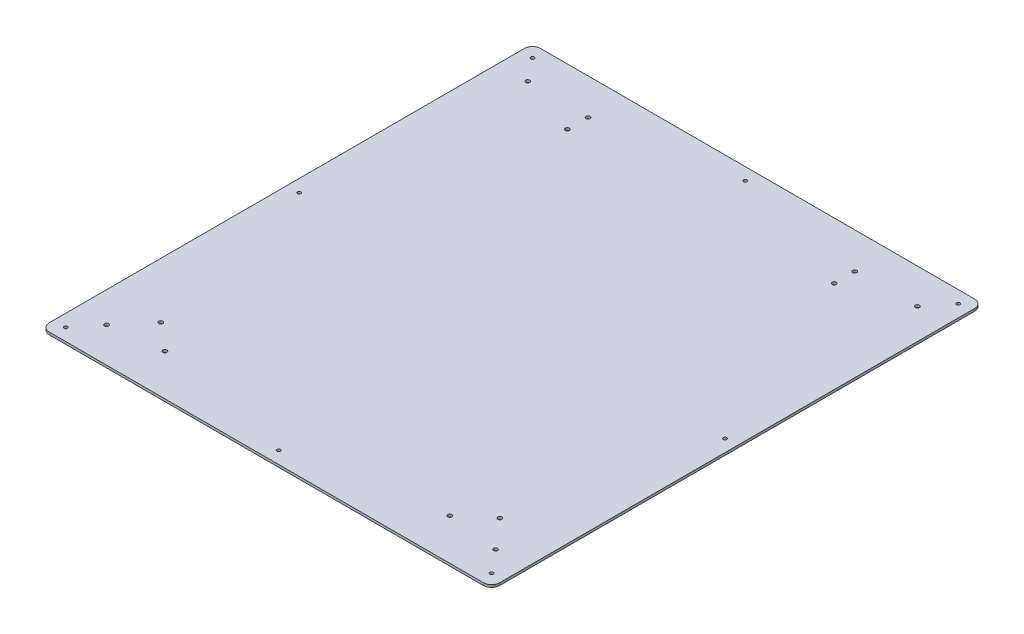
ISO-10303-21;
HEADER;
FILE_DESCRIPTION(('STEP AP214'),'2;1');
FILE_NAME('part.step','',(''),(''),'','','');
FILE_SCHEMA(('AUTOMOTIVE_DESIGN { 1 0 10303 214 1 1 1 1 }'));
ENDSEC;
DATA;
#1=APPLICATION_CONTEXT('core data for automotive mechanical design processes');
#2=APPLICATION_PROTOCOL_DEFINITION('international standard','automotive_design',2000,#1);
#3=PRODUCT_CONTEXT('',#1,'mechanical');
#4=PRODUCT('Part','Part','',(#3));
#5=PRODUCT_RELATED_PRODUCT_CATEGORY('part','',(#4));
#6=PRODUCT_DEFINITION_FORMATION('','',#4);
#7=PRODUCT_DEFINITION_CONTEXT('part definition',#1,'design');
#8=PRODUCT_DEFINITION('design','',#6,#7);
#9=PRODUCT_DEFINITION_SHAPE('','',#8);
#10=(LENGTH_UNIT() NAMED_UNIT(*) SI_UNIT(.MILLI.,.METRE.));
#11=(NAMED_UNIT(*) PLANE_ANGLE_UNIT() SI_UNIT($,.RADIAN.));
#12=(NAMED_UNIT(*) SI_UNIT($,.STERADIAN.) SOLID_ANGLE_UNIT());
#13=UNCERTAINTY_MEASURE_WITH_UNIT(LENGTH_MEASURE(1.E-05),#10,'distance_accuracy_value','');
#14=(GEOMETRIC_REPRESENTATION_CONTEXT(3) GLOBAL_UNCERTAINTY_ASSIGNED_CONTEXT((#13)) GLOBAL_UNIT_ASSIGNED_CONTEXT((#10,
#11,#12)) REPRESENTATION_CONTEXT('',''));
#15=CARTESIAN_POINT('',(0.,0.,0.));
#16=DIRECTION('',(0.,0.,1.));
#17=DIRECTION('',(1.,0.,0.));
#18=AXIS2_PLACEMENT_3D('',#15,#16,#17);
#19=CARTESIAN_POINT('',(265.,-3.,-290.));
#20=DIRECTION('',(0.,1.,0.));
#21=DIRECTION('',(0.,0.,1.));
#22=AXIS2_PLACEMENT_3D('',#19,#20,#21);
#23=CYLINDRICAL_SURFACE('',#22,10.);
#24=CARTESIAN_POINT('',(265.,0.,-290.));
#25=DIRECTION('',(0.,1.,0.));
#26=DIRECTION('',(0.,0.,-1.));
#27=AXIS2_PLACEMENT_3D('',#24,#25,#26);
#28=CIRCLE('',#27,10.);
#29=CARTESIAN_POINT('',(275.,0.,-290.));
#30=VERTEX_POINT('',#29);
#31=CARTESIAN_POINT('',(265.,0.,-300.));
#32=VERTEX_POINT('',#31);
#33=EDGE_CURVE('E142',#30,#32,#28,.T.);
#34=ORIENTED_EDGE('',*,*,#33,.F.);
#35=DIRECTION('',(0.,1.,0.));
#36=VECTOR('',#35,1.);
#37=CARTESIAN_POINT('',(275.,-3.,-290.));
#38=LINE('',#37,#36);
#39=CARTESIAN_POINT('',(275.,-3.,-290.));
#40=VERTEX_POINT('',#39);
#41=EDGE_CURVE('E11',#40,#30,#38,.T.);
#42=ORIENTED_EDGE('',*,*,#41,.F.);
#43=CARTESIAN_POINT('',(265.,-3.,-290.));
#44=DIRECTION('',(0.,1.,0.));
#45=DIRECTION('',(0.,0.,-1.));
#46=AXIS2_PLACEMENT_3D('',#43,#44,#45);
#47=CIRCLE('',#46,10.);
#48=CARTESIAN_POINT('',(265.,-3.,-300.));
#49=VERTEX_POINT('',#48);
#50=EDGE_CURVE('E163',#40,#49,#47,.T.);
#51=ORIENTED_EDGE('',*,*,#50,.T.);
#52=DIRECTION('',(0.,1.,0.));
#53=VECTOR('',#52,1.);
#54=CARTESIAN_POINT('',(265.,-3.,-300.));
#55=LINE('',#54,#53);
#56=EDGE_CURVE('E48',#49,#32,#55,.T.);
#57=ORIENTED_EDGE('',*,*,#56,.T.);
#58=EDGE_LOOP('',(#34,#42,#51,#57));
#59=FACE_BOUND('',#58,.T.);
#60=ADVANCED_FACE('F45',(#59),#23,.T.);
#61=CARTESIAN_POINT('',(275.,-3.,290.));
#62=DIRECTION('',(1.,0.,0.));
#63=DIRECTION('',(0.,0.,-1.));
#64=AXIS2_PLACEMENT_3D('',#61,#62,#63);
#65=PLANE('',#64);
#66=DIRECTION('',(0.,0.,-1.));
#67=VECTOR('',#66,1.);
#68=CARTESIAN_POINT('',(275.,0.,290.));
#69=LINE('',#68,#67);
#70=CARTESIAN_POINT('',(275.,0.,290.));
#71=VERTEX_POINT('',#70);
#72=EDGE_CURVE('E161',#71,#30,#69,.T.);
#73=ORIENTED_EDGE('',*,*,#72,.F.);
#74=DIRECTION('',(0.,1.,0.));
#75=VECTOR('',#74,1.);
#76=CARTESIAN_POINT('',(275.,-3.,290.));
#77=LINE('',#76,#75);
#78=CARTESIAN_POINT('',(275.,-3.,290.));
#79=VERTEX_POINT('',#78);
#80=EDGE_CURVE('E54',#79,#71,#77,.T.);
#81=ORIENTED_EDGE('',*,*,#80,.F.);
#82=DIRECTION('',(0.,0.,-1.));
#83=VECTOR('',#82,1.);
#84=CARTESIAN_POINT('',(275.,-3.,290.));
#85=LINE('',#84,#83);
#86=EDGE_CURVE('E132',#79,#40,#85,.T.);
#87=ORIENTED_EDGE('',*,*,#86,.T.);
#88=ORIENTED_EDGE('',*,*,#41,.T.);
#89=EDGE_LOOP('',(#73,#81,#87,#88));
#90=FACE_BOUND('',#89,.T.);
#91=ADVANCED_FACE('F175',(#90),#65,.T.);
#92=CARTESIAN_POINT('',(265.,-3.,290.));
#93=DIRECTION('',(0.,1.,0.));
#94=DIRECTION('',(0.,0.,1.));
#95=AXIS2_PLACEMENT_3D('',#92,#93,#94);
#96=CYLINDRICAL_SURFACE('',#95,10.);
#97=CARTESIAN_POINT('',(265.,0.,290.));
#98=DIRECTION('',(0.,1.,0.));
#99=DIRECTION('',(0.,0.,1.));
#100=AXIS2_PLACEMENT_3D('',#97,#98,#99);
#101=CIRCLE('',#100,10.);
#102=CARTESIAN_POINT('',(265.,0.,300.));
#103=VERTEX_POINT('',#102);
#104=EDGE_CURVE('E119',#103,#71,#101,.T.);
#105=ORIENTED_EDGE('',*,*,#104,.F.);
#106=DIRECTION('',(0.,1.,0.));
#107=VECTOR('',#106,1.);
#108=CARTESIAN_POINT('',(265.,-3.,300.));
#109=LINE('',#108,#107);
#110=CARTESIAN_POINT('',(265.,-3.,300.));
#111=VERTEX_POINT('',#110);
#112=EDGE_CURVE('E114',#111,#103,#109,.T.);
#113=ORIENTED_EDGE('',*,*,#112,.F.);
#114=CARTESIAN_POINT('',(265.,-3.,290.));
#115=DIRECTION('',(0.,1.,0.));
#116=DIRECTION('',(0.,0.,1.));
#117=AXIS2_PLACEMENT_3D('',#114,#115,#116);
#118=CIRCLE('',#117,10.);
#119=EDGE_CURVE('E117',#111,#79,#118,.T.);
#120=ORIENTED_EDGE('',*,*,#119,.T.);
#121=ORIENTED_EDGE('',*,*,#80,.T.);
#122=EDGE_LOOP('',(#105,#113,#120,#121));
#123=FACE_BOUND('',#122,.T.);
#124=ADVANCED_FACE('F116',(#123),#96,.T.);
#125=CARTESIAN_POINT('',(-265.,-3.,300.));
#126=DIRECTION('',(0.,0.,1.));
#127=DIRECTION('',(1.,0.,0.));
#128=AXIS2_PLACEMENT_3D('',#125,#126,#127);
#129=PLANE('',#128);
#130=DIRECTION('',(1.,0.,0.));
#131=VECTOR('',#130,1.);
#132=CARTESIAN_POINT('',(-265.,0.,300.));
#133=LINE('',#132,#131);
#134=CARTESIAN_POINT('',(-265.,0.,300.));
#135=VERTEX_POINT('',#134);
#136=EDGE_CURVE('E158',#135,#103,#133,.T.);
#137=ORIENTED_EDGE('',*,*,#136,.F.);
#138=DIRECTION('',(0.,1.,0.));
#139=VECTOR('',#138,1.);
#140=CARTESIAN_POINT('',(-265.,-3.,300.));
#141=LINE('',#140,#139);
#142=CARTESIAN_POINT('',(-265.,-3.,300.));
#143=VERTEX_POINT('',#142);
#144=EDGE_CURVE('E124',#143,#135,#141,.T.);
#145=ORIENTED_EDGE('',*,*,#144,.F.);
#146=DIRECTION('',(1.,0.,0.));
#147=VECTOR('',#146,1.);
#148=CARTESIAN_POINT('',(-265.,-3.,300.));
#149=LINE('',#148,#147);
#150=EDGE_CURVE('E130',#143,#111,#149,.T.);
#151=ORIENTED_EDGE('',*,*,#150,.T.);
#152=ORIENTED_EDGE('',*,*,#112,.T.);
#153=EDGE_LOOP('',(#137,#145,#151,#152));
#154=FACE_BOUND('',#153,.T.);
#155=ADVANCED_FACE('F134',(#154),#129,.T.);
#156=CARTESIAN_POINT('',(-265.,-3.,290.));
#157=DIRECTION('',(0.,1.,0.));
#158=DIRECTION('',(0.,0.,1.));
#159=AXIS2_PLACEMENT_3D('',#156,#157,#158);
#160=CYLINDRICAL_SURFACE('',#159,10.);
#161=CARTESIAN_POINT('',(-265.,0.,290.));
#162=DIRECTION('',(0.,1.,0.));
#163=DIRECTION('',(0.,0.,-1.));
#164=AXIS2_PLACEMENT_3D('',#161,#162,#163);
#165=CIRCLE('',#164,10.);
#166=CARTESIAN_POINT('',(-275.,0.,290.));
#167=VERTEX_POINT('',#166);
#168=EDGE_CURVE('E155',#167,#135,#165,.T.);
#169=ORIENTED_EDGE('',*,*,#168,.F.);
#170=DIRECTION('',(0.,1.,0.));
#171=VECTOR('',#170,1.);
#172=CARTESIAN_POINT('',(-275.,-3.,290.));
#173=LINE('',#172,#171);
#174=CARTESIAN_POINT('',(-275.,-3.,290.));
#175=VERTEX_POINT('',#174);
#176=EDGE_CURVE('E167',#175,#167,#173,.T.);
#177=ORIENTED_EDGE('',*,*,#176,.F.);
#178=CARTESIAN_POINT('',(-265.,-3.,290.));
#179=DIRECTION('',(0.,1.,0.));
#180=DIRECTION('',(0.,0.,-1.));
#181=AXIS2_PLACEMENT_3D('',#178,#179,#180);
#182=CIRCLE('',#181,10.);
#183=EDGE_CURVE('E135',#175,#143,#182,.T.);
#184=ORIENTED_EDGE('',*,*,#183,.T.);
#185=ORIENTED_EDGE('',*,*,#144,.T.);
#186=EDGE_LOOP('',(#169,#177,#184,#185));
#187=FACE_BOUND('',#186,.T.);
#188=ADVANCED_FACE('F188',(#187),#160,.T.);
#189=CARTESIAN_POINT('',(-275.,-3.,290.));
#190=DIRECTION('',(-1.,0.,0.));
#191=DIRECTION('',(0.,0.,1.));
#192=AXIS2_PLACEMENT_3D('',#189,#190,#191);
#193=PLANE('',#192);
#194=DIRECTION('',(0.,0.,1.));
#195=VECTOR('',#194,1.);
#196=CARTESIAN_POINT('',(-275.,0.,290.));
#197=LINE('',#196,#195);
#198=CARTESIAN_POINT('',(-275.,0.,-290.));
#199=VERTEX_POINT('',#198);
#200=EDGE_CURVE('E152',#199,#167,#197,.T.);
#201=ORIENTED_EDGE('',*,*,#200,.F.);
#202=DIRECTION('',(0.,1.,0.));
#203=VECTOR('',#202,1.);
#204=CARTESIAN_POINT('',(-275.,-3.,-290.));
#205=LINE('',#204,#203);
#206=CARTESIAN_POINT('',(-275.,-3.,-290.));
#207=VERTEX_POINT('',#206);
#208=EDGE_CURVE('E169',#207,#199,#205,.T.);
#209=ORIENTED_EDGE('',*,*,#208,.F.);
#210=DIRECTION('',(0.,0.,1.));
#211=VECTOR('',#210,1.);
#212=CARTESIAN_POINT('',(-275.,-3.,290.));
#213=LINE('',#212,#211);
#214=EDGE_CURVE('E137',#207,#175,#213,.T.);
#215=ORIENTED_EDGE('',*,*,#214,.T.);
#216=ORIENTED_EDGE('',*,*,#176,.T.);
#217=EDGE_LOOP('',(#201,#209,#215,#216));
#218=FACE_BOUND('',#217,.T.);
#219=ADVANCED_FACE('F191',(#218),#193,.T.);
#220=CARTESIAN_POINT('',(-265.,-3.,-290.));
#221=DIRECTION('',(0.,1.,0.));
#222=DIRECTION('',(0.,0.,1.));
#223=AXIS2_PLACEMENT_3D('',#220,#221,#222);
#224=CYLINDRICAL_SURFACE('',#223,10.);
#225=CARTESIAN_POINT('',(-265.,0.,-290.));
#226=DIRECTION('',(0.,1.,0.));
#227=DIRECTION('',(0.,0.,-1.));
#228=AXIS2_PLACEMENT_3D('',#225,#226,#227);
#229=CIRCLE('',#228,10.);
#230=CARTESIAN_POINT('',(-265.,0.,-300.));
#231=VERTEX_POINT('',#230);
#232=EDGE_CURVE('E149',#231,#199,#229,.T.);
#233=ORIENTED_EDGE('',*,*,#232,.F.);
#234=DIRECTION('',(0.,1.,0.));
#235=VECTOR('',#234,1.);
#236=CARTESIAN_POINT('',(-265.,-3.,-300.));
#237=LINE('',#236,#235);
#238=CARTESIAN_POINT('',(-265.,-3.,-300.));
#239=VERTEX_POINT('',#238);
#240=EDGE_CURVE('E170',#239,#231,#237,.T.);
#241=ORIENTED_EDGE('',*,*,#240,.F.);
#242=CARTESIAN_POINT('',(-265.,-3.,-290.));
#243=DIRECTION('',(0.,1.,0.));
#244=DIRECTION('',(0.,0.,-1.));
#245=AXIS2_PLACEMENT_3D('',#242,#243,#244);
#246=CIRCLE('',#245,10.);
#247=EDGE_CURVE('E417',#239,#207,#246,.T.);
#248=ORIENTED_EDGE('',*,*,#247,.T.);
#249=ORIENTED_EDGE('',*,*,#208,.T.);
#250=EDGE_LOOP('',(#233,#241,#248,#249));
#251=FACE_BOUND('',#250,.T.);
#252=ADVANCED_FACE('F195',(#251),#224,.T.);
#253=CARTESIAN_POINT('',(-265.,-3.,-300.));
#254=DIRECTION('',(0.,0.,-1.));
#255=DIRECTION('',(-1.,0.,0.));
#256=AXIS2_PLACEMENT_3D('',#253,#254,#255);
#257=PLANE('',#256);
#258=DIRECTION('',(-1.,0.,0.));
#259=VECTOR('',#258,1.);
#260=CARTESIAN_POINT('',(-265.,0.,-300.));
#261=LINE('',#260,#259);
#262=EDGE_CURVE('E145',#32,#231,#261,.T.);
#263=ORIENTED_EDGE('',*,*,#262,.F.);
#264=ORIENTED_EDGE('',*,*,#56,.F.);
#265=DIRECTION('',(-1.,0.,0.));
#266=VECTOR('',#265,1.);
#267=CARTESIAN_POINT('',(-265.,-3.,-300.));
#268=LINE('',#267,#266);
#269=EDGE_CURVE('E415',#49,#239,#268,.T.);
#270=ORIENTED_EDGE('',*,*,#269,.T.);
#271=ORIENTED_EDGE('',*,*,#240,.T.);
#272=EDGE_LOOP('',(#263,#264,#270,#271));
#273=FACE_BOUND('',#272,.T.);
#274=ADVANCED_FACE('F172',(#273),#257,.T.);
#275=CARTESIAN_POINT('',(265.,-3.,-290.));
#276=DIRECTION('',(0.,-1.,0.));
#277=DIRECTION('',(0.,0.,-1.));
#278=AXIS2_PLACEMENT_3D('',#275,#276,#277);
#279=PLANE('',#278);
#280=CARTESIAN_POINT('',(-163.135330985521,-3.,-230.852456374504));
#281=DIRECTION('',(0.,1.,0.));
#282=DIRECTION('',(0.,0.,1.));
#283=AXIS2_PLACEMENT_3D('',#280,#281,#282);
#284=CIRCLE('',#283,2.50000000000015);
#285=CARTESIAN_POINT('',(-163.135330985521,-3.,-228.352456374504));
#286=VERTEX_POINT('',#285);
#287=EDGE_CURVE('E294',#286,#286,#284,.T.);
#288=ORIENTED_EDGE('',*,*,#287,.T.);
#289=EDGE_LOOP('',(#288));
#290=FACE_BOUND('',#289,.T.);
#291=CARTESIAN_POINT('',(-238.223807061623,-3.,-257.352456374504));
#292=DIRECTION('',(0.,1.,0.));
#293=DIRECTION('',(0.,0.,1.));
#294=AXIS2_PLACEMENT_3D('',#291,#292,#293);
#295=CIRCLE('',#294,2.49999999999992);
#296=CARTESIAN_POINT('',(-238.223807061623,-3.,-254.852456374505));
#297=VERTEX_POINT('',#296);
#298=EDGE_CURVE('E302',#297,#297,#295,.T.);
#299=ORIENTED_EDGE('',*,*,#298,.T.);
#300=EDGE_LOOP('',(#299));
#301=FACE_BOUND('',#300,.T.);
#302=CARTESIAN_POINT('',(-163.135330985521,-3.,-255.852456374504));
#303=DIRECTION('',(0.,1.,0.));
#304=DIRECTION('',(0.,0.,1.));
#305=AXIS2_PLACEMENT_3D('',#302,#303,#304);
#306=CIRCLE('',#305,2.50000000000017);
#307=CARTESIAN_POINT('',(-163.135330985521,-3.,-253.352456374504));
#308=VERTEX_POINT('',#307);
#309=EDGE_CURVE('E308',#308,#308,#306,.T.);
#310=ORIENTED_EDGE('',*,*,#309,.T.);
#311=EDGE_LOOP('',(#310));
#312=FACE_BOUND('',#311,.T.);
#313=CARTESIAN_POINT('',(162.687716862278,-3.,-255.852456374505));
#314=DIRECTION('',(0.,1.,0.));
#315=DIRECTION('',(0.,0.,1.));
#316=AXIS2_PLACEMENT_3D('',#313,#314,#315);
#317=CIRCLE('',#316,2.50000000000016);
#318=CARTESIAN_POINT('',(162.687716862278,-3.,-253.352456374505));
#319=VERTEX_POINT('',#318);
#320=EDGE_CURVE('E314',#319,#319,#317,.T.);
#321=ORIENTED_EDGE('',*,*,#320,.T.);
#322=EDGE_LOOP('',(#321));
#323=FACE_BOUND('',#322,.T.);
#324=CARTESIAN_POINT('',(162.687716862278,-3.,-230.852456374505));
#325=DIRECTION('',(0.,1.,0.));
#326=DIRECTION('',(0.,0.,1.));
#327=AXIS2_PLACEMENT_3D('',#324,#325,#326);
#328=CIRCLE('',#327,2.50000000000016);
#329=CARTESIAN_POINT('',(162.687716862278,-3.,-228.352456374505));
#330=VERTEX_POINT('',#329);
#331=EDGE_CURVE('E320',#330,#330,#328,.T.);
#332=ORIENTED_EDGE('',*,*,#331,.T.);
#333=EDGE_LOOP('',(#332));
#334=FACE_BOUND('',#333,.T.);
#335=CARTESIAN_POINT('',(237.77619293838,-3.,-257.352456374504));
#336=DIRECTION('',(0.,1.,0.));
#337=DIRECTION('',(0.,0.,1.));
#338=AXIS2_PLACEMENT_3D('',#335,#336,#337);
#339=CIRCLE('',#338,2.49999999999986);
#340=CARTESIAN_POINT('',(237.77619293838,-3.,-254.852456374505));
#341=VERTEX_POINT('',#340);
#342=EDGE_CURVE('E326',#341,#341,#339,.T.);
#343=ORIENTED_EDGE('',*,*,#342,.T.);
#344=EDGE_LOOP('',(#343));
#345=FACE_BOUND('',#344,.T.);
#346=CARTESIAN_POINT('',(237.328578815138,-3.,257.352456374504));
#347=DIRECTION('',(0.,1.,0.));
#348=DIRECTION('',(0.,0.,1.));
#349=AXIS2_PLACEMENT_3D('',#346,#347,#348);
#350=CIRCLE('',#349,2.4999999999999);
#351=CARTESIAN_POINT('',(237.328578815138,-3.,259.852456374504));
#352=VERTEX_POINT('',#351);
#353=EDGE_CURVE('E332',#352,#352,#350,.T.);
#354=ORIENTED_EDGE('',*,*,#353,.T.);
#355=EDGE_LOOP('',(#354));
#356=FACE_BOUND('',#355,.T.);
#357=CARTESIAN_POINT('',(-237.77619293838,-3.,257.352456374506));
#358=DIRECTION('',(0.,1.,0.));
#359=DIRECTION('',(0.,0.,1.));
#360=AXIS2_PLACEMENT_3D('',#357,#358,#359);
#361=CIRCLE('',#360,2.50000000000042);
#362=CARTESIAN_POINT('',(-237.77619293838,-3.,259.852456374507));
#363=VERTEX_POINT('',#362);
#364=EDGE_CURVE('E338',#363,#363,#361,.T.);
#365=ORIENTED_EDGE('',*,*,#364,.T.);
#366=EDGE_LOOP('',(#365));
#367=FACE_BOUND('',#366,.T.);
#368=CARTESIAN_POINT('',(-207.223807061622,-3.,221.647543625456));
#369=DIRECTION('',(0.,1.,0.));
#370=DIRECTION('',(0.,0.,1.));
#371=AXIS2_PLACEMENT_3D('',#368,#369,#370);
#372=CIRCLE('',#371,2.49999999999989);
#373=CARTESIAN_POINT('',(-207.223807061622,-3.,224.147543625456));
#374=VERTEX_POINT('',#373);
#375=EDGE_CURVE('E344',#374,#374,#372,.T.);
#376=ORIENTED_EDGE('',*,*,#375,.T.);
#377=EDGE_LOOP('',(#376));
#378=FACE_BOUND('',#377,.T.);
#379=CARTESIAN_POINT('',(-174.223807061622,-3.,249.647543625456));
#380=DIRECTION('',(0.,1.,0.));
#381=DIRECTION('',(0.,0.,1.));
#382=AXIS2_PLACEMENT_3D('',#379,#380,#381);
#383=CIRCLE('',#382,2.49999999999993);
#384=CARTESIAN_POINT('',(-174.223807061622,-3.,252.147543625456));
#385=VERTEX_POINT('',#384);
#386=EDGE_CURVE('E350',#385,#385,#383,.T.);
#387=ORIENTED_EDGE('',*,*,#386,.T.);
#388=EDGE_LOOP('',(#387));
#389=FACE_BOUND('',#388,.T.);
#390=CARTESIAN_POINT('',(173.776192938381,-3.,249.647543625456));
#391=DIRECTION('',(0.,1.,0.));
#392=DIRECTION('',(0.,0.,1.));
#393=AXIS2_PLACEMENT_3D('',#390,#391,#392);
#394=CIRCLE('',#393,2.49999999999991);
#395=CARTESIAN_POINT('',(173.776192938381,-3.,252.147543625456));
#396=VERTEX_POINT('',#395);
#397=EDGE_CURVE('E356',#396,#396,#394,.T.);
#398=ORIENTED_EDGE('',*,*,#397,.T.);
#399=EDGE_LOOP('',(#398));
#400=FACE_BOUND('',#399,.T.);
#401=CARTESIAN_POINT('',(206.77619293838,-3.,221.647543625456));
#402=DIRECTION('',(0.,1.,0.));
#403=DIRECTION('',(0.,0.,1.));
#404=AXIS2_PLACEMENT_3D('',#401,#402,#403);
#405=CIRCLE('',#404,2.50000000000013);
#406=CARTESIAN_POINT('',(206.77619293838,-3.,224.147543625456));
#407=VERTEX_POINT('',#406);
#408=EDGE_CURVE('E362',#407,#407,#405,.T.);
#409=ORIENTED_EDGE('',*,*,#408,.T.);
#410=EDGE_LOOP('',(#409));
#411=FACE_BOUND('',#410,.T.);
#412=CARTESIAN_POINT('',(-1.11022302462516E-12,-3.,285.000000000001));
#413=DIRECTION('',(0.,1.,0.));
#414=DIRECTION('',(0.,0.,1.));
#415=AXIS2_PLACEMENT_3D('',#412,#413,#414);
#416=CIRCLE('',#415,2.09999999999999);
#417=CARTESIAN_POINT('',(-1.11022302462516E-12,-3.,287.100000000001));
#418=VERTEX_POINT('',#417);
#419=EDGE_CURVE('E368',#418,#418,#416,.T.);
#420=ORIENTED_EDGE('',*,*,#419,.T.);
#421=EDGE_LOOP('',(#420));
#422=FACE_BOUND('',#421,.T.);
#423=CARTESIAN_POINT('',(259.999999999998,-3.,0.));
#424=DIRECTION('',(0.,1.,0.));
#425=DIRECTION('',(0.,0.,1.));
#426=AXIS2_PLACEMENT_3D('',#423,#424,#425);
#427=CIRCLE('',#426,2.09999999999999);
#428=CARTESIAN_POINT('',(259.999999999998,-3.,2.10000000000004));
#429=VERTEX_POINT('',#428);
#430=EDGE_CURVE('E374',#429,#429,#427,.T.);
#431=ORIENTED_EDGE('',*,*,#430,.T.);
#432=EDGE_LOOP('',(#431));
#433=FACE_BOUND('',#432,.T.);
#434=CARTESIAN_POINT('',(-1.11022302462516E-12,-3.,-285.000000000001));
#435=DIRECTION('',(0.,1.,0.));
#436=DIRECTION('',(0.,0.,1.));
#437=AXIS2_PLACEMENT_3D('',#434,#435,#436);
#438=CIRCLE('',#437,2.09999999999999);
#439=CARTESIAN_POINT('',(-1.11022302462516E-12,-3.,-282.900000000001));
#440=VERTEX_POINT('',#439);
#441=EDGE_CURVE('E380',#440,#440,#438,.T.);
#442=ORIENTED_EDGE('',*,*,#441,.T.);
#443=EDGE_LOOP('',(#442));
#444=FACE_BOUND('',#443,.T.);
#445=CARTESIAN_POINT('',(-259.999999999996,-3.,0.));
#446=DIRECTION('',(0.,1.,0.));
#447=DIRECTION('',(0.,0.,1.));
#448=AXIS2_PLACEMENT_3D('',#445,#446,#447);
#449=CIRCLE('',#448,2.09999999999999);
#450=CARTESIAN_POINT('',(-259.999999999996,-3.,2.10000000000005));
#451=VERTEX_POINT('',#450);
#452=EDGE_CURVE('E386',#451,#451,#449,.T.);
#453=ORIENTED_EDGE('',*,*,#452,.T.);
#454=EDGE_LOOP('',(#453));
#455=FACE_BOUND('',#454,.T.);
#456=CARTESIAN_POINT('',(-260.,-3.,285.));
#457=DIRECTION('',(0.,1.,0.));
#458=DIRECTION('',(0.,0.,-1.));
#459=AXIS2_PLACEMENT_3D('',#456,#457,#458);
#460=CIRCLE('',#459,2.09999999999999);
#461=CARTESIAN_POINT('',(-260.,-3.,282.9));
#462=VERTEX_POINT('',#461);
#463=EDGE_CURVE('E392',#462,#462,#460,.T.);
#464=ORIENTED_EDGE('',*,*,#463,.T.);
#465=EDGE_LOOP('',(#464));
#466=FACE_BOUND('',#465,.T.);
#467=CARTESIAN_POINT('',(259.999999999998,-3.,285.000000000002));
#468=DIRECTION('',(0.,1.,0.));
#469=DIRECTION('',(0.,0.,1.));
#470=AXIS2_PLACEMENT_3D('',#467,#468,#469);
#471=CIRCLE('',#470,2.09999999999999);
#472=CARTESIAN_POINT('',(259.999999999998,-3.,287.100000000002));
#473=VERTEX_POINT('',#472);
#474=EDGE_CURVE('E398',#473,#473,#471,.T.);
#475=ORIENTED_EDGE('',*,*,#474,.T.);
#476=EDGE_LOOP('',(#475));
#477=FACE_BOUND('',#476,.T.);
#478=CARTESIAN_POINT('',(259.999999999998,-3.,-285.000000000002));
#479=DIRECTION('',(0.,1.,0.));
#480=DIRECTION('',(0.,0.,-1.));
#481=AXIS2_PLACEMENT_3D('',#478,#479,#480);
#482=CIRCLE('',#481,2.09999999999999);
#483=CARTESIAN_POINT('',(259.999999999998,-3.,-287.100000000002));
#484=VERTEX_POINT('',#483);
#485=EDGE_CURVE('E404',#484,#484,#482,.T.);
#486=ORIENTED_EDGE('',*,*,#485,.T.);
#487=EDGE_LOOP('',(#486));
#488=FACE_BOUND('',#487,.T.);
#489=CARTESIAN_POINT('',(-260.,-3.,-285.));
#490=DIRECTION('',(0.,1.,0.));
#491=DIRECTION('',(0.,0.,1.));
#492=AXIS2_PLACEMENT_3D('',#489,#490,#491);
#493=CIRCLE('',#492,2.09999999999999);
#494=CARTESIAN_POINT('',(-260.,-3.,-282.9));
#495=VERTEX_POINT('',#494);
#496=EDGE_CURVE('E146',#495,#495,#493,.T.);
#497=ORIENTED_EDGE('',*,*,#496,.T.);
#498=EDGE_LOOP('',(#497));
#499=FACE_BOUND('',#498,.T.);
#500=ORIENTED_EDGE('',*,*,#50,.F.);
#501=ORIENTED_EDGE('',*,*,#86,.F.);
#502=ORIENTED_EDGE('',*,*,#119,.F.);
#503=ORIENTED_EDGE('',*,*,#150,.F.);
#504=ORIENTED_EDGE('',*,*,#183,.F.);
#505=ORIENTED_EDGE('',*,*,#214,.F.);
#506=ORIENTED_EDGE('',*,*,#247,.F.);
#507=ORIENTED_EDGE('',*,*,#269,.F.);
#508=EDGE_LOOP('',(#500,#501,#502,#503,#504,#505,#506,#507));
#509=FACE_BOUND('',#508,.T.);
#510=ADVANCED_FACE('F128',(#290,#301,#312,#323,#334,#345,#356,#367,#378,#389,#400,#411,#422,
#433,#444,#455,#466,#477,#488,#499,#509),#279,.T.);
#511=CARTESIAN_POINT('',(265.,0.,-290.));
#512=DIRECTION('',(0.,-1.,0.));
#513=DIRECTION('',(0.,0.,-1.));
#514=AXIS2_PLACEMENT_3D('',#511,#512,#513);
#515=PLANE('',#514);
#516=CARTESIAN_POINT('',(-163.135330985521,0.,-230.852456374504));
#517=DIRECTION('',(0.,1.,0.));
#518=DIRECTION('',(0.,0.,1.));
#519=AXIS2_PLACEMENT_3D('',#516,#517,#518);
#520=CIRCLE('',#519,2.50000000000015);
#521=CARTESIAN_POINT('',(-163.135330985521,0.,-228.352456374504));
#522=VERTEX_POINT('',#521);
#523=EDGE_CURVE('E297',#522,#522,#520,.T.);
#524=ORIENTED_EDGE('',*,*,#523,.F.);
#525=EDGE_LOOP('',(#524));
#526=FACE_BOUND('',#525,.T.);
#527=CARTESIAN_POINT('',(-238.223807061623,0.,-257.352456374504));
#528=DIRECTION('',(0.,1.,0.));
#529=DIRECTION('',(0.,0.,1.));
#530=AXIS2_PLACEMENT_3D('',#527,#528,#529);
#531=CIRCLE('',#530,2.49999999999992);
#532=CARTESIAN_POINT('',(-238.223807061623,0.,-254.852456374505));
#533=VERTEX_POINT('',#532);
#534=EDGE_CURVE('E299',#533,#533,#531,.T.);
#535=ORIENTED_EDGE('',*,*,#534,.F.);
#536=EDGE_LOOP('',(#535));
#537=FACE_BOUND('',#536,.T.);
#538=CARTESIAN_POINT('',(-163.135330985521,0.,-255.852456374504));
#539=DIRECTION('',(0.,1.,0.));
#540=DIRECTION('',(0.,0.,1.));
#541=AXIS2_PLACEMENT_3D('',#538,#539,#540);
#542=CIRCLE('',#541,2.50000000000017);
#543=CARTESIAN_POINT('',(-163.135330985521,0.,-253.352456374504));
#544=VERTEX_POINT('',#543);
#545=EDGE_CURVE('E305',#544,#544,#542,.T.);
#546=ORIENTED_EDGE('',*,*,#545,.F.);
#547=EDGE_LOOP('',(#546));
#548=FACE_BOUND('',#547,.T.);
#549=CARTESIAN_POINT('',(162.687716862278,0.,-255.852456374505));
#550=DIRECTION('',(0.,1.,0.));
#551=DIRECTION('',(0.,0.,1.));
#552=AXIS2_PLACEMENT_3D('',#549,#550,#551);
#553=CIRCLE('',#552,2.50000000000016);
#554=CARTESIAN_POINT('',(162.687716862278,0.,-253.352456374505));
#555=VERTEX_POINT('',#554);
#556=EDGE_CURVE('E311',#555,#555,#553,.T.);
#557=ORIENTED_EDGE('',*,*,#556,.F.);
#558=EDGE_LOOP('',(#557));
#559=FACE_BOUND('',#558,.T.);
#560=CARTESIAN_POINT('',(162.687716862278,0.,-230.852456374505));
#561=DIRECTION('',(0.,1.,0.));
#562=DIRECTION('',(0.,0.,1.));
#563=AXIS2_PLACEMENT_3D('',#560,#561,#562);
#564=CIRCLE('',#563,2.50000000000016);
#565=CARTESIAN_POINT('',(162.687716862278,0.,-228.352456374505));
#566=VERTEX_POINT('',#565);
#567=EDGE_CURVE('E317',#566,#566,#564,.T.);
#568=ORIENTED_EDGE('',*,*,#567,.F.);
#569=EDGE_LOOP('',(#568));
#570=FACE_BOUND('',#569,.T.);
#571=CARTESIAN_POINT('',(237.77619293838,0.,-257.352456374504));
#572=DIRECTION('',(0.,1.,0.));
#573=DIRECTION('',(0.,0.,1.));
#574=AXIS2_PLACEMENT_3D('',#571,#572,#573);
#575=CIRCLE('',#574,2.49999999999986);
#576=CARTESIAN_POINT('',(237.77619293838,0.,-254.852456374505));
#577=VERTEX_POINT('',#576);
#578=EDGE_CURVE('E323',#577,#577,#575,.T.);
#579=ORIENTED_EDGE('',*,*,#578,.F.);
#580=EDGE_LOOP('',(#579));
#581=FACE_BOUND('',#580,.T.);
#582=CARTESIAN_POINT('',(237.328578815138,0.,257.352456374504));
#583=DIRECTION('',(0.,1.,0.));
#584=DIRECTION('',(0.,0.,1.));
#585=AXIS2_PLACEMENT_3D('',#582,#583,#584);
#586=CIRCLE('',#585,2.4999999999999);
#587=CARTESIAN_POINT('',(237.328578815138,0.,259.852456374504));
#588=VERTEX_POINT('',#587);
#589=EDGE_CURVE('E329',#588,#588,#586,.T.);
#590=ORIENTED_EDGE('',*,*,#589,.F.);
#591=EDGE_LOOP('',(#590));
#592=FACE_BOUND('',#591,.T.);
#593=CARTESIAN_POINT('',(-237.77619293838,0.,257.352456374506));
#594=DIRECTION('',(0.,1.,0.));
#595=DIRECTION('',(0.,0.,1.));
#596=AXIS2_PLACEMENT_3D('',#593,#594,#595);
#597=CIRCLE('',#596,2.50000000000042);
#598=CARTESIAN_POINT('',(-237.77619293838,0.,259.852456374507));
#599=VERTEX_POINT('',#598);
#600=EDGE_CURVE('E335',#599,#599,#597,.T.);
#601=ORIENTED_EDGE('',*,*,#600,.F.);
#602=EDGE_LOOP('',(#601));
#603=FACE_BOUND('',#602,.T.);
#604=CARTESIAN_POINT('',(-207.223807061622,0.,221.647543625456));
#605=DIRECTION('',(0.,1.,0.));
#606=DIRECTION('',(0.,0.,1.));
#607=AXIS2_PLACEMENT_3D('',#604,#605,#606);
#608=CIRCLE('',#607,2.49999999999989);
#609=CARTESIAN_POINT('',(-207.223807061622,0.,224.147543625456));
#610=VERTEX_POINT('',#609);
#611=EDGE_CURVE('E341',#610,#610,#608,.T.);
#612=ORIENTED_EDGE('',*,*,#611,.F.);
#613=EDGE_LOOP('',(#612));
#614=FACE_BOUND('',#613,.T.);
#615=CARTESIAN_POINT('',(-174.223807061622,0.,249.647543625456));
#616=DIRECTION('',(0.,1.,0.));
#617=DIRECTION('',(0.,0.,1.));
#618=AXIS2_PLACEMENT_3D('',#615,#616,#617);
#619=CIRCLE('',#618,2.49999999999993);
#620=CARTESIAN_POINT('',(-174.223807061622,0.,252.147543625456));
#621=VERTEX_POINT('',#620);
#622=EDGE_CURVE('E347',#621,#621,#619,.T.);
#623=ORIENTED_EDGE('',*,*,#622,.F.);
#624=EDGE_LOOP('',(#623));
#625=FACE_BOUND('',#624,.T.);
#626=CARTESIAN_POINT('',(173.776192938381,0.,249.647543625456));
#627=DIRECTION('',(0.,1.,0.));
#628=DIRECTION('',(0.,0.,1.));
#629=AXIS2_PLACEMENT_3D('',#626,#627,#628);
#630=CIRCLE('',#629,2.49999999999991);
#631=CARTESIAN_POINT('',(173.776192938381,0.,252.147543625456));
#632=VERTEX_POINT('',#631);
#633=EDGE_CURVE('E353',#632,#632,#630,.T.);
#634=ORIENTED_EDGE('',*,*,#633,.F.);
#635=EDGE_LOOP('',(#634));
#636=FACE_BOUND('',#635,.T.);
#637=CARTESIAN_POINT('',(206.77619293838,0.,221.647543625456));
#638=DIRECTION('',(0.,1.,0.));
#639=DIRECTION('',(0.,0.,1.));
#640=AXIS2_PLACEMENT_3D('',#637,#638,#639);
#641=CIRCLE('',#640,2.50000000000013);
#642=CARTESIAN_POINT('',(206.77619293838,0.,224.147543625456));
#643=VERTEX_POINT('',#642);
#644=EDGE_CURVE('E359',#643,#643,#641,.T.);
#645=ORIENTED_EDGE('',*,*,#644,.F.);
#646=EDGE_LOOP('',(#645));
#647=FACE_BOUND('',#646,.T.);
#648=CARTESIAN_POINT('',(-1.11022302462516E-12,0.,285.000000000001));
#649=DIRECTION('',(0.,1.,0.));
#650=DIRECTION('',(0.,0.,1.));
#651=AXIS2_PLACEMENT_3D('',#648,#649,#650);
#652=CIRCLE('',#651,2.09999999999999);
#653=CARTESIAN_POINT('',(-1.11022302462516E-12,0.,287.100000000001));
#654=VERTEX_POINT('',#653);
#655=EDGE_CURVE('E365',#654,#654,#652,.T.);
#656=ORIENTED_EDGE('',*,*,#655,.F.);
#657=EDGE_LOOP('',(#656));
#658=FACE_BOUND('',#657,.T.);
#659=CARTESIAN_POINT('',(259.999999999998,0.,0.));
#660=DIRECTION('',(0.,1.,0.));
#661=DIRECTION('',(0.,0.,1.));
#662=AXIS2_PLACEMENT_3D('',#659,#660,#661);
#663=CIRCLE('',#662,2.09999999999999);
#664=CARTESIAN_POINT('',(259.999999999998,0.,2.10000000000004));
#665=VERTEX_POINT('',#664);
#666=EDGE_CURVE('E371',#665,#665,#663,.T.);
#667=ORIENTED_EDGE('',*,*,#666,.F.);
#668=EDGE_LOOP('',(#667));
#669=FACE_BOUND('',#668,.T.);
#670=CARTESIAN_POINT('',(-1.11022302462516E-12,0.,-285.000000000001));
#671=DIRECTION('',(0.,1.,0.));
#672=DIRECTION('',(0.,0.,1.));
#673=AXIS2_PLACEMENT_3D('',#670,#671,#672);
#674=CIRCLE('',#673,2.09999999999999);
#675=CARTESIAN_POINT('',(-1.11022302462516E-12,0.,-282.900000000001));
#676=VERTEX_POINT('',#675);
#677=EDGE_CURVE('E377',#676,#676,#674,.T.);
#678=ORIENTED_EDGE('',*,*,#677,.F.);
#679=EDGE_LOOP('',(#678));
#680=FACE_BOUND('',#679,.T.);
#681=CARTESIAN_POINT('',(-259.999999999996,0.,0.));
#682=DIRECTION('',(0.,1.,0.));
#683=DIRECTION('',(0.,0.,1.));
#684=AXIS2_PLACEMENT_3D('',#681,#682,#683);
#685=CIRCLE('',#684,2.09999999999999);
#686=CARTESIAN_POINT('',(-259.999999999996,0.,2.10000000000005));
#687=VERTEX_POINT('',#686);
#688=EDGE_CURVE('E383',#687,#687,#685,.T.);
#689=ORIENTED_EDGE('',*,*,#688,.F.);
#690=EDGE_LOOP('',(#689));
#691=FACE_BOUND('',#690,.T.);
#692=CARTESIAN_POINT('',(-260.,0.,285.));
#693=DIRECTION('',(0.,1.,0.));
#694=DIRECTION('',(0.,0.,-1.));
#695=AXIS2_PLACEMENT_3D('',#692,#693,#694);
#696=CIRCLE('',#695,2.09999999999999);
#697=CARTESIAN_POINT('',(-260.,0.,282.9));
#698=VERTEX_POINT('',#697);
#699=EDGE_CURVE('E389',#698,#698,#696,.T.);
#700=ORIENTED_EDGE('',*,*,#699,.F.);
#701=EDGE_LOOP('',(#700));
#702=FACE_BOUND('',#701,.T.);
#703=CARTESIAN_POINT('',(259.999999999998,0.,285.000000000002));
#704=DIRECTION('',(0.,1.,0.));
#705=DIRECTION('',(0.,0.,1.));
#706=AXIS2_PLACEMENT_3D('',#703,#704,#705);
#707=CIRCLE('',#706,2.09999999999999);
#708=CARTESIAN_POINT('',(259.999999999998,0.,287.100000000002));
#709=VERTEX_POINT('',#708);
#710=EDGE_CURVE('E395',#709,#709,#707,.T.);
#711=ORIENTED_EDGE('',*,*,#710,.F.);
#712=EDGE_LOOP('',(#711));
#713=FACE_BOUND('',#712,.T.);
#714=CARTESIAN_POINT('',(259.999999999998,0.,-285.000000000002));
#715=DIRECTION('',(0.,1.,0.));
#716=DIRECTION('',(0.,0.,-1.));
#717=AXIS2_PLACEMENT_3D('',#714,#715,#716);
#718=CIRCLE('',#717,2.09999999999999);
#719=CARTESIAN_POINT('',(259.999999999998,0.,-287.100000000002));
#720=VERTEX_POINT('',#719);
#721=EDGE_CURVE('E401',#720,#720,#718,.T.);
#722=ORIENTED_EDGE('',*,*,#721,.F.);
#723=EDGE_LOOP('',(#722));
#724=FACE_BOUND('',#723,.T.);
#725=CARTESIAN_POINT('',(-260.,0.,-285.));
#726=DIRECTION('',(0.,1.,0.));
#727=DIRECTION('',(0.,0.,1.));
#728=AXIS2_PLACEMENT_3D('',#725,#726,#727);
#729=CIRCLE('',#728,2.09999999999999);
#730=CARTESIAN_POINT('',(-260.,0.,-282.9));
#731=VERTEX_POINT('',#730);
#732=EDGE_CURVE('E407',#731,#731,#729,.T.);
#733=ORIENTED_EDGE('',*,*,#732,.F.);
#734=EDGE_LOOP('',(#733));
#735=FACE_BOUND('',#734,.T.);
#736=ORIENTED_EDGE('',*,*,#33,.T.);
#737=ORIENTED_EDGE('',*,*,#262,.T.);
#738=ORIENTED_EDGE('',*,*,#232,.T.);
#739=ORIENTED_EDGE('',*,*,#200,.T.);
#740=ORIENTED_EDGE('',*,*,#168,.T.);
#741=ORIENTED_EDGE('',*,*,#136,.T.);
#742=ORIENTED_EDGE('',*,*,#104,.T.);
#743=ORIENTED_EDGE('',*,*,#72,.T.);
#744=EDGE_LOOP('',(#736,#737,#738,#739,#740,#741,#742,#743));
#745=FACE_BOUND('',#744,.T.);
#746=ADVANCED_FACE('F174',(#526,#537,#548,#559,#570,#581,#592,#603,#614,#625,#636,#647,#658,
#669,#680,#691,#702,#713,#724,#735,#745),#515,.F.);
#747=CARTESIAN_POINT('',(-260.,-3.,-285.));
#748=DIRECTION('',(0.,1.,0.));
#749=DIRECTION('',(0.,0.,1.));
#750=AXIS2_PLACEMENT_3D('',#747,#748,#749);
#751=CYLINDRICAL_SURFACE('',#750,2.09999999999999);
#752=ORIENTED_EDGE('',*,*,#496,.F.);
#753=EDGE_LOOP('',(#752));
#754=FACE_BOUND('',#753,.T.);
#755=ORIENTED_EDGE('',*,*,#732,.T.);
#756=EDGE_LOOP('',(#755));
#757=FACE_BOUND('',#756,.T.);
#758=ADVANCED_FACE('F207',(#754,#757),#751,.F.);
#759=CARTESIAN_POINT('',(259.999999999998,-3.,-285.000000000002));
#760=DIRECTION('',(0.,1.,0.));
#761=DIRECTION('',(0.,0.,1.));
#762=AXIS2_PLACEMENT_3D('',#759,#760,#761);
#763=CYLINDRICAL_SURFACE('',#762,2.09999999999999);
#764=ORIENTED_EDGE('',*,*,#485,.F.);
#765=EDGE_LOOP('',(#764));
#766=FACE_BOUND('',#765,.T.);
#767=ORIENTED_EDGE('',*,*,#721,.T.);
#768=EDGE_LOOP('',(#767));
#769=FACE_BOUND('',#768,.T.);
#770=ADVANCED_FACE('F214',(#766,#769),#763,.F.);
#771=CARTESIAN_POINT('',(259.999999999998,-3.,285.000000000002));
#772=DIRECTION('',(0.,1.,0.));
#773=DIRECTION('',(0.,0.,1.));
#774=AXIS2_PLACEMENT_3D('',#771,#772,#773);
#775=CYLINDRICAL_SURFACE('',#774,2.09999999999999);
#776=ORIENTED_EDGE('',*,*,#474,.F.);
#777=EDGE_LOOP('',(#776));
#778=FACE_BOUND('',#777,.T.);
#779=ORIENTED_EDGE('',*,*,#710,.T.);
#780=EDGE_LOOP('',(#779));
#781=FACE_BOUND('',#780,.T.);
#782=ADVANCED_FACE('F218',(#778,#781),#775,.F.);
#783=CARTESIAN_POINT('',(-260.,-3.,285.));
#784=DIRECTION('',(0.,1.,0.));
#785=DIRECTION('',(0.,0.,1.));
#786=AXIS2_PLACEMENT_3D('',#783,#784,#785);
#787=CYLINDRICAL_SURFACE('',#786,2.09999999999999);
#788=ORIENTED_EDGE('',*,*,#463,.F.);
#789=EDGE_LOOP('',(#788));
#790=FACE_BOUND('',#789,.T.);
#791=ORIENTED_EDGE('',*,*,#699,.T.);
#792=EDGE_LOOP('',(#791));
#793=FACE_BOUND('',#792,.T.);
#794=ADVANCED_FACE('F222',(#790,#793),#787,.F.);
#795=CARTESIAN_POINT('',(-259.999999999996,-3.,0.));
#796=DIRECTION('',(0.,1.,0.));
#797=DIRECTION('',(0.,0.,1.));
#798=AXIS2_PLACEMENT_3D('',#795,#796,#797);
#799=CYLINDRICAL_SURFACE('',#798,2.09999999999999);
#800=ORIENTED_EDGE('',*,*,#452,.F.);
#801=EDGE_LOOP('',(#800));
#802=FACE_BOUND('',#801,.T.);
#803=ORIENTED_EDGE('',*,*,#688,.T.);
#804=EDGE_LOOP('',(#803));
#805=FACE_BOUND('',#804,.T.);
#806=ADVANCED_FACE('F226',(#802,#805),#799,.F.);
#807=CARTESIAN_POINT('',(-1.11022302462516E-12,-3.,-285.000000000001));
#808=DIRECTION('',(0.,1.,0.));
#809=DIRECTION('',(0.,0.,1.));
#810=AXIS2_PLACEMENT_3D('',#807,#808,#809);
#811=CYLINDRICAL_SURFACE('',#810,2.09999999999999);
#812=ORIENTED_EDGE('',*,*,#441,.F.);
#813=EDGE_LOOP('',(#812));
#814=FACE_BOUND('',#813,.T.);
#815=ORIENTED_EDGE('',*,*,#677,.T.);
#816=EDGE_LOOP('',(#815));
#817=FACE_BOUND('',#816,.T.);
#818=ADVANCED_FACE('F230',(#814,#817),#811,.F.);
#819=CARTESIAN_POINT('',(259.999999999998,-3.,0.));
#820=DIRECTION('',(0.,1.,0.));
#821=DIRECTION('',(0.,0.,1.));
#822=AXIS2_PLACEMENT_3D('',#819,#820,#821);
#823=CYLINDRICAL_SURFACE('',#822,2.09999999999999);
#824=ORIENTED_EDGE('',*,*,#430,.F.);
#825=EDGE_LOOP('',(#824));
#826=FACE_BOUND('',#825,.T.);
#827=ORIENTED_EDGE('',*,*,#666,.T.);
#828=EDGE_LOOP('',(#827));
#829=FACE_BOUND('',#828,.T.);
#830=ADVANCED_FACE('F234',(#826,#829),#823,.F.);
#831=CARTESIAN_POINT('',(-1.11022302462516E-12,-3.,285.000000000001));
#832=DIRECTION('',(0.,1.,0.));
#833=DIRECTION('',(0.,0.,1.));
#834=AXIS2_PLACEMENT_3D('',#831,#832,#833);
#835=CYLINDRICAL_SURFACE('',#834,2.09999999999999);
#836=ORIENTED_EDGE('',*,*,#419,.F.);
#837=EDGE_LOOP('',(#836));
#838=FACE_BOUND('',#837,.T.);
#839=ORIENTED_EDGE('',*,*,#655,.T.);
#840=EDGE_LOOP('',(#839));
#841=FACE_BOUND('',#840,.T.);
#842=ADVANCED_FACE('F238',(#838,#841),#835,.F.);
#843=CARTESIAN_POINT('',(206.77619293838,-3.,221.647543625456));
#844=DIRECTION('',(0.,1.,0.));
#845=DIRECTION('',(0.,0.,1.));
#846=AXIS2_PLACEMENT_3D('',#843,#844,#845);
#847=CYLINDRICAL_SURFACE('',#846,2.50000000000013);
#848=ORIENTED_EDGE('',*,*,#408,.F.);
#849=EDGE_LOOP('',(#848));
#850=FACE_BOUND('',#849,.T.);
#851=ORIENTED_EDGE('',*,*,#644,.T.);
#852=EDGE_LOOP('',(#851));
#853=FACE_BOUND('',#852,.T.);
#854=ADVANCED_FACE('F242',(#850,#853),#847,.F.);
#855=CARTESIAN_POINT('',(173.776192938381,-3.,249.647543625456));
#856=DIRECTION('',(0.,1.,0.));
#857=DIRECTION('',(0.,0.,1.));
#858=AXIS2_PLACEMENT_3D('',#855,#856,#857);
#859=CYLINDRICAL_SURFACE('',#858,2.49999999999991);
#860=ORIENTED_EDGE('',*,*,#397,.F.);
#861=EDGE_LOOP('',(#860));
#862=FACE_BOUND('',#861,.T.);
#863=ORIENTED_EDGE('',*,*,#633,.T.);
#864=EDGE_LOOP('',(#863));
#865=FACE_BOUND('',#864,.T.);
#866=ADVANCED_FACE('F246',(#862,#865),#859,.F.);
#867=CARTESIAN_POINT('',(-174.223807061622,-3.,249.647543625456));
#868=DIRECTION('',(0.,1.,0.));
#869=DIRECTION('',(0.,0.,1.));
#870=AXIS2_PLACEMENT_3D('',#867,#868,#869);
#871=CYLINDRICAL_SURFACE('',#870,2.49999999999993);
#872=ORIENTED_EDGE('',*,*,#386,.F.);
#873=EDGE_LOOP('',(#872));
#874=FACE_BOUND('',#873,.T.);
#875=ORIENTED_EDGE('',*,*,#622,.T.);
#876=EDGE_LOOP('',(#875));
#877=FACE_BOUND('',#876,.T.);
#878=ADVANCED_FACE('F250',(#874,#877),#871,.F.);
#879=CARTESIAN_POINT('',(-207.223807061622,-3.,221.647543625456));
#880=DIRECTION('',(0.,1.,0.));
#881=DIRECTION('',(0.,0.,1.));
#882=AXIS2_PLACEMENT_3D('',#879,#880,#881);
#883=CYLINDRICAL_SURFACE('',#882,2.49999999999989);
#884=ORIENTED_EDGE('',*,*,#375,.F.);
#885=EDGE_LOOP('',(#884));
#886=FACE_BOUND('',#885,.T.);
#887=ORIENTED_EDGE('',*,*,#611,.T.);
#888=EDGE_LOOP('',(#887));
#889=FACE_BOUND('',#888,.T.);
#890=ADVANCED_FACE('F254',(#886,#889),#883,.F.);
#891=CARTESIAN_POINT('',(-237.77619293838,-3.,257.352456374506));
#892=DIRECTION('',(0.,1.,0.));
#893=DIRECTION('',(0.,0.,1.));
#894=AXIS2_PLACEMENT_3D('',#891,#892,#893);
#895=CYLINDRICAL_SURFACE('',#894,2.50000000000042);
#896=ORIENTED_EDGE('',*,*,#364,.F.);
#897=EDGE_LOOP('',(#896));
#898=FACE_BOUND('',#897,.T.);
#899=ORIENTED_EDGE('',*,*,#600,.T.);
#900=EDGE_LOOP('',(#899));
#901=FACE_BOUND('',#900,.T.);
#902=ADVANCED_FACE('F258',(#898,#901),#895,.F.);
#903=CARTESIAN_POINT('',(237.328578815138,-3.,257.352456374504));
#904=DIRECTION('',(0.,1.,0.));
#905=DIRECTION('',(0.,0.,1.));
#906=AXIS2_PLACEMENT_3D('',#903,#904,#905);
#907=CYLINDRICAL_SURFACE('',#906,2.4999999999999);
#908=ORIENTED_EDGE('',*,*,#353,.F.);
#909=EDGE_LOOP('',(#908));
#910=FACE_BOUND('',#909,.T.);
#911=ORIENTED_EDGE('',*,*,#589,.T.);
#912=EDGE_LOOP('',(#911));
#913=FACE_BOUND('',#912,.T.);
#914=ADVANCED_FACE('F262',(#910,#913),#907,.F.);
#915=CARTESIAN_POINT('',(237.77619293838,-3.,-257.352456374504));
#916=DIRECTION('',(0.,1.,0.));
#917=DIRECTION('',(0.,0.,1.));
#918=AXIS2_PLACEMENT_3D('',#915,#916,#917);
#919=CYLINDRICAL_SURFACE('',#918,2.49999999999986);
#920=ORIENTED_EDGE('',*,*,#342,.F.);
#921=EDGE_LOOP('',(#920));
#922=FACE_BOUND('',#921,.T.);
#923=ORIENTED_EDGE('',*,*,#578,.T.);
#924=EDGE_LOOP('',(#923));
#925=FACE_BOUND('',#924,.T.);
#926=ADVANCED_FACE('F266',(#922,#925),#919,.F.);
#927=CARTESIAN_POINT('',(162.687716862278,-3.,-230.852456374505));
#928=DIRECTION('',(0.,1.,0.));
#929=DIRECTION('',(0.,0.,1.));
#930=AXIS2_PLACEMENT_3D('',#927,#928,#929);
#931=CYLINDRICAL_SURFACE('',#930,2.50000000000016);
#932=ORIENTED_EDGE('',*,*,#331,.F.);
#933=EDGE_LOOP('',(#932));
#934=FACE_BOUND('',#933,.T.);
#935=ORIENTED_EDGE('',*,*,#567,.T.);
#936=EDGE_LOOP('',(#935));
#937=FACE_BOUND('',#936,.T.);
#938=ADVANCED_FACE('F270',(#934,#937),#931,.F.);
#939=CARTESIAN_POINT('',(162.687716862278,-3.,-255.852456374505));
#940=DIRECTION('',(0.,1.,0.));
#941=DIRECTION('',(0.,0.,1.));
#942=AXIS2_PLACEMENT_3D('',#939,#940,#941);
#943=CYLINDRICAL_SURFACE('',#942,2.50000000000016);
#944=ORIENTED_EDGE('',*,*,#320,.F.);
#945=EDGE_LOOP('',(#944));
#946=FACE_BOUND('',#945,.T.);
#947=ORIENTED_EDGE('',*,*,#556,.T.);
#948=EDGE_LOOP('',(#947));
#949=FACE_BOUND('',#948,.T.);
#950=ADVANCED_FACE('F274',(#946,#949),#943,.F.);
#951=CARTESIAN_POINT('',(-163.135330985521,-3.,-255.852456374504));
#952=DIRECTION('',(0.,1.,0.));
#953=DIRECTION('',(0.,0.,1.));
#954=AXIS2_PLACEMENT_3D('',#951,#952,#953);
#955=CYLINDRICAL_SURFACE('',#954,2.50000000000017);
#956=ORIENTED_EDGE('',*,*,#309,.F.);
#957=EDGE_LOOP('',(#956));
#958=FACE_BOUND('',#957,.T.);
#959=ORIENTED_EDGE('',*,*,#545,.T.);
#960=EDGE_LOOP('',(#959));
#961=FACE_BOUND('',#960,.T.);
#962=ADVANCED_FACE('F278',(#958,#961),#955,.F.);
#963=CARTESIAN_POINT('',(-238.223807061623,-3.,-257.352456374504));
#964=DIRECTION('',(0.,1.,0.));
#965=DIRECTION('',(0.,0.,1.));
#966=AXIS2_PLACEMENT_3D('',#963,#964,#965);
#967=CYLINDRICAL_SURFACE('',#966,2.49999999999992);
#968=ORIENTED_EDGE('',*,*,#298,.F.);
#969=EDGE_LOOP('',(#968));
#970=FACE_BOUND('',#969,.T.);
#971=ORIENTED_EDGE('',*,*,#534,.T.);
#972=EDGE_LOOP('',(#971));
#973=FACE_BOUND('',#972,.T.);
#974=ADVANCED_FACE('F282',(#970,#973),#967,.F.);
#975=CARTESIAN_POINT('',(-163.135330985521,-3.,-230.852456374504));
#976=DIRECTION('',(0.,1.,0.));
#977=DIRECTION('',(0.,0.,1.));
#978=AXIS2_PLACEMENT_3D('',#975,#976,#977);
#979=CYLINDRICAL_SURFACE('',#978,2.50000000000015);
#980=ORIENTED_EDGE('',*,*,#287,.F.);
#981=EDGE_LOOP('',(#980));
#982=FACE_BOUND('',#981,.T.);
#983=ORIENTED_EDGE('',*,*,#523,.T.);
#984=EDGE_LOOP('',(#983));
#985=FACE_BOUND('',#984,.T.);
#986=ADVANCED_FACE('F286',(#982,#985),#979,.F.);
#987=CLOSED_SHELL('',(#60,#91,#124,#155,#188,#219,#252,#274,#510,#746,#758,#770,#782,#794,#806,
#818,#830,#842,#854,#866,#878,#890,#902,#914,#926,#938,#950,#962,#974,#986));
#988=MANIFOLD_SOLID_BREP('B2',#987);
#989=ADVANCED_BREP_SHAPE_REPRESENTATION('',(#18,#988),#14);
#990=SHAPE_DEFINITION_REPRESENTATION(#9,#989);
ENDSEC;
END-ISO-10303-21;
